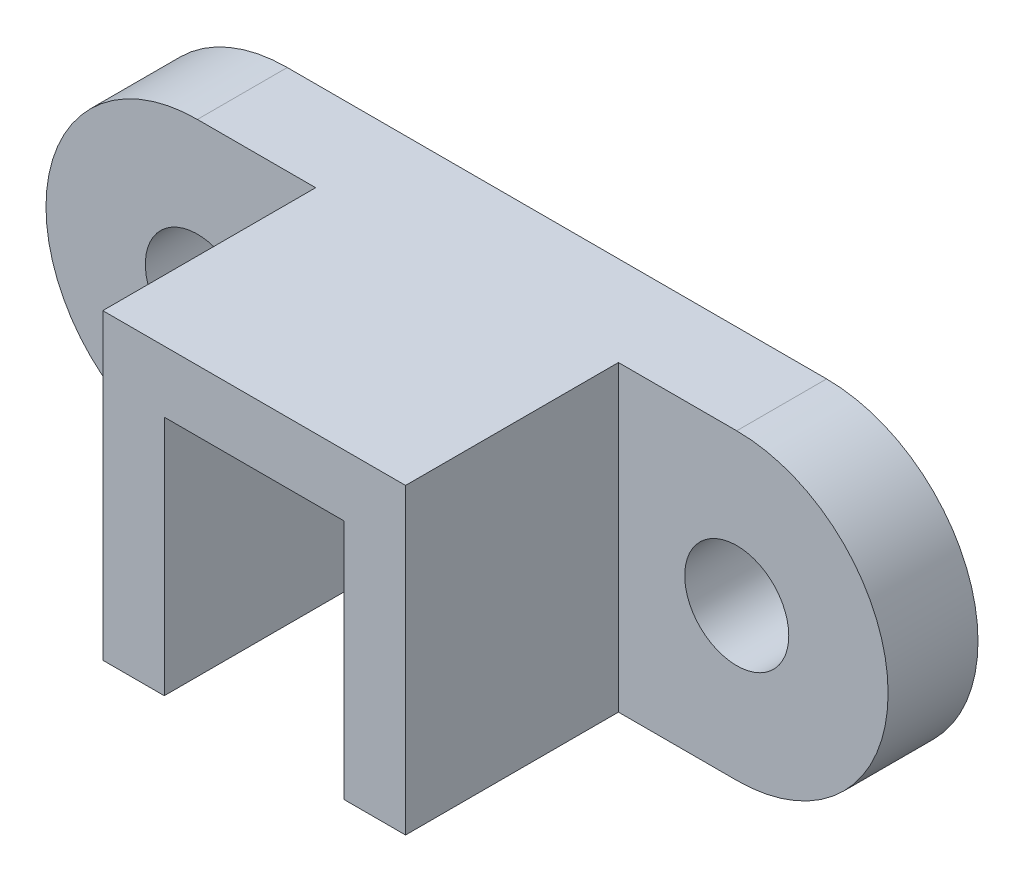
ISO-10303-21;
HEADER;
FILE_DESCRIPTION(('STEP AP214'),'2;1');
FILE_NAME('part.step','',(''),(''),'','','');
FILE_SCHEMA(('AUTOMOTIVE_DESIGN { 1 0 10303 214 1 1 1 1 }'));
ENDSEC;
DATA;
#1=APPLICATION_CONTEXT('core data for automotive mechanical design processes');
#2=APPLICATION_PROTOCOL_DEFINITION('international standard','automotive_design',2000,#1);
#3=PRODUCT_CONTEXT('',#1,'mechanical');
#4=PRODUCT('Part','Part','',(#3));
#5=PRODUCT_RELATED_PRODUCT_CATEGORY('part','',(#4));
#6=PRODUCT_DEFINITION_FORMATION('','',#4);
#7=PRODUCT_DEFINITION_CONTEXT('part definition',#1,'design');
#8=PRODUCT_DEFINITION('design','',#6,#7);
#9=PRODUCT_DEFINITION_SHAPE('','',#8);
#10=(LENGTH_UNIT() NAMED_UNIT(*) SI_UNIT(.MILLI.,.METRE.));
#11=(NAMED_UNIT(*) PLANE_ANGLE_UNIT() SI_UNIT($,.RADIAN.));
#12=(NAMED_UNIT(*) SI_UNIT($,.STERADIAN.) SOLID_ANGLE_UNIT());
#13=UNCERTAINTY_MEASURE_WITH_UNIT(LENGTH_MEASURE(1.E-05),#10,'distance_accuracy_value','');
#14=(GEOMETRIC_REPRESENTATION_CONTEXT(3) GLOBAL_UNCERTAINTY_ASSIGNED_CONTEXT((#13)) GLOBAL_UNIT_ASSIGNED_CONTEXT((#10,
#11,#12)) REPRESENTATION_CONTEXT('',''));
#15=CARTESIAN_POINT('',(0.,0.,0.));
#16=DIRECTION('',(0.,0.,1.));
#17=DIRECTION('',(1.,0.,0.));
#18=AXIS2_PLACEMENT_3D('',#15,#16,#17);
#19=CARTESIAN_POINT('',(19.,19.,13.));
#20=DIRECTION('',(1.,0.,0.));
#21=DIRECTION('',(0.,0.,-1.));
#22=AXIS2_PLACEMENT_3D('',#19,#20,#21);
#23=PLANE('',#22);
#24=DIRECTION('',(0.,0.707106781186548,0.707106781186548));
#25=VECTOR('',#24,1.);
#26=CARTESIAN_POINT('',(19.,19.,64.));
#27=LINE('',#26,#25);
#28=CARTESIAN_POINT('',(19.,-32.,13.));
#29=VERTEX_POINT('',#28);
#30=CARTESIAN_POINT('',(19.,19.,64.));
#31=VERTEX_POINT('',#30);
#32=EDGE_CURVE('E139',#29,#31,#27,.T.);
#33=ORIENTED_EDGE('',*,*,#32,.F.);
#34=DIRECTION('',(0.,0.,1.));
#35=VECTOR('',#34,1.);
#36=CARTESIAN_POINT('',(19.,-32.,13.));
#37=LINE('',#36,#35);
#38=CARTESIAN_POINT('',(19.,-32.,64.));
#39=VERTEX_POINT('',#38);
#40=EDGE_CURVE('E142',#29,#39,#37,.T.);
#41=ORIENTED_EDGE('',*,*,#40,.T.);
#42=DIRECTION('',(0.,-1.,0.));
#43=VECTOR('',#42,1.);
#44=CARTESIAN_POINT('',(19.,19.,64.));
#45=LINE('',#44,#43);
#46=EDGE_CURVE('E54',#31,#39,#45,.T.);
#47=ORIENTED_EDGE('',*,*,#46,.F.);
#48=EDGE_LOOP('',(#33,#41,#47));
#49=FACE_BOUND('',#48,.T.);
#50=ADVANCED_FACE('F39',(#49),#23,.F.);
#51=CARTESIAN_POINT('',(-19.,19.,64.));
#52=DIRECTION('',(-1.,0.,0.));
#53=DIRECTION('',(0.,0.,1.));
#54=AXIS2_PLACEMENT_3D('',#51,#52,#53);
#55=PLANE('',#54);
#56=DIRECTION('',(0.,0.707106781186548,0.707106781186548));
#57=VECTOR('',#56,1.);
#58=CARTESIAN_POINT('',(-19.,19.,64.));
#59=LINE('',#58,#57);
#60=CARTESIAN_POINT('',(-19.,-32.,13.));
#61=VERTEX_POINT('',#60);
#62=CARTESIAN_POINT('',(-19.,19.,64.));
#63=VERTEX_POINT('',#62);
#64=EDGE_CURVE('E133',#61,#63,#59,.T.);
#65=ORIENTED_EDGE('',*,*,#64,.T.);
#66=DIRECTION('',(0.,-1.,0.));
#67=VECTOR('',#66,1.);
#68=CARTESIAN_POINT('',(-19.,19.,64.));
#69=LINE('',#68,#67);
#70=CARTESIAN_POINT('',(-19.,-32.,64.));
#71=VERTEX_POINT('',#70);
#72=EDGE_CURVE('E121',#63,#71,#69,.T.);
#73=ORIENTED_EDGE('',*,*,#72,.T.);
#74=DIRECTION('',(0.,0.,-1.));
#75=VECTOR('',#74,1.);
#76=CARTESIAN_POINT('',(-19.,-32.,64.));
#77=LINE('',#76,#75);
#78=EDGE_CURVE('E135',#71,#61,#77,.T.);
#79=ORIENTED_EDGE('',*,*,#78,.T.);
#80=EDGE_LOOP('',(#65,#73,#79));
#81=FACE_BOUND('',#80,.T.);
#82=ADVANCED_FACE('F134',(#81),#55,.F.);
#83=CARTESIAN_POINT('',(-57.,0.,19.));
#84=DIRECTION('',(0.,0.,1.));
#85=DIRECTION('',(1.,0.,0.));
#86=AXIS2_PLACEMENT_3D('',#83,#84,#85);
#87=PLANE('',#86);
#88=DIRECTION('',(0.,1.,0.));
#89=VECTOR('',#88,1.);
#90=CARTESIAN_POINT('',(32.,-32.,19.));
#91=LINE('',#90,#89);
#92=CARTESIAN_POINT('',(32.,-32.,19.));
#93=VERTEX_POINT('',#92);
#94=CARTESIAN_POINT('',(32.,32.,19.));
#95=VERTEX_POINT('',#94);
#96=EDGE_CURVE('E155',#93,#95,#91,.T.);
#97=ORIENTED_EDGE('',*,*,#96,.F.);
#98=DIRECTION('',(1.,0.,0.));
#99=VECTOR('',#98,1.);
#100=CARTESIAN_POINT('',(-57.,-32.,19.));
#101=LINE('',#100,#99);
#102=CARTESIAN_POINT('',(57.,-32.,19.));
#103=VERTEX_POINT('',#102);
#104=EDGE_CURVE('E192',#93,#103,#101,.T.);
#105=ORIENTED_EDGE('',*,*,#104,.T.);
#106=CARTESIAN_POINT('',(57.,0.,19.));
#107=DIRECTION('',(0.,0.,1.));
#108=DIRECTION('',(1.,0.,0.));
#109=AXIS2_PLACEMENT_3D('',#106,#107,#108);
#110=CIRCLE('',#109,32.);
#111=CARTESIAN_POINT('',(57.,32.,19.));
#112=VERTEX_POINT('',#111);
#113=EDGE_CURVE('E196',#103,#112,#110,.T.);
#114=ORIENTED_EDGE('',*,*,#113,.T.);
#115=DIRECTION('',(-1.,0.,0.));
#116=VECTOR('',#115,1.);
#117=CARTESIAN_POINT('',(-57.,32.,19.));
#118=LINE('',#117,#116);
#119=EDGE_CURVE('E199',#112,#95,#118,.T.);
#120=ORIENTED_EDGE('',*,*,#119,.T.);
#121=EDGE_LOOP('',(#97,#105,#114,#120));
#122=FACE_BOUND('',#121,.T.);
#123=CARTESIAN_POINT('',(57.,0.,19.));
#124=DIRECTION('',(0.,0.,1.));
#125=DIRECTION('',(1.,0.,0.));
#126=AXIS2_PLACEMENT_3D('',#123,#124,#125);
#127=CIRCLE('',#126,11.);
#128=CARTESIAN_POINT('',(68.,0.,19.));
#129=VERTEX_POINT('',#128);
#130=EDGE_CURVE('E184',#129,#129,#127,.T.);
#131=ORIENTED_EDGE('',*,*,#130,.F.);
#132=EDGE_LOOP('',(#131));
#133=FACE_BOUND('',#132,.T.);
#134=ADVANCED_FACE('F246',(#122,#133),#87,.T.);
#135=CARTESIAN_POINT('',(-57.,0.,19.));
#136=DIRECTION('',(0.,0.,-1.));
#137=DIRECTION('',(-1.,0.,0.));
#138=AXIS2_PLACEMENT_3D('',#135,#136,#137);
#139=CYLINDRICAL_SURFACE('',#138,32.);
#140=CARTESIAN_POINT('',(-57.,0.,0.));
#141=DIRECTION('',(0.,0.,1.));
#142=DIRECTION('',(1.,0.,0.));
#143=AXIS2_PLACEMENT_3D('',#140,#141,#142);
#144=CIRCLE('',#143,32.);
#145=CARTESIAN_POINT('',(-57.,32.,0.));
#146=VERTEX_POINT('',#145);
#147=CARTESIAN_POINT('',(-57.,-32.,0.));
#148=VERTEX_POINT('',#147);
#149=EDGE_CURVE('E180',#146,#148,#144,.T.);
#150=ORIENTED_EDGE('',*,*,#149,.T.);
#151=DIRECTION('',(0.,0.,-1.));
#152=VECTOR('',#151,1.);
#153=CARTESIAN_POINT('',(-57.,-32.,19.));
#154=LINE('',#153,#152);
#155=CARTESIAN_POINT('',(-57.,-32.,19.));
#156=VERTEX_POINT('',#155);
#157=EDGE_CURVE('E11',#156,#148,#154,.T.);
#158=ORIENTED_EDGE('',*,*,#157,.F.);
#159=CARTESIAN_POINT('',(-57.,0.,19.));
#160=DIRECTION('',(0.,0.,1.));
#161=DIRECTION('',(1.,0.,0.));
#162=AXIS2_PLACEMENT_3D('',#159,#160,#161);
#163=CIRCLE('',#162,32.);
#164=CARTESIAN_POINT('',(-57.,32.,19.));
#165=VERTEX_POINT('',#164);
#166=EDGE_CURVE('E189',#165,#156,#163,.T.);
#167=ORIENTED_EDGE('',*,*,#166,.F.);
#168=DIRECTION('',(0.,0.,-1.));
#169=VECTOR('',#168,1.);
#170=CARTESIAN_POINT('',(-57.,32.,19.));
#171=LINE('',#170,#169);
#172=EDGE_CURVE('E201',#165,#146,#171,.T.);
#173=ORIENTED_EDGE('',*,*,#172,.T.);
#174=EDGE_LOOP('',(#150,#158,#167,#173));
#175=FACE_BOUND('',#174,.T.);
#176=ADVANCED_FACE('F41',(#175),#139,.T.);
#177=CARTESIAN_POINT('',(-57.,-32.,19.));
#178=DIRECTION('',(0.,1.,0.));
#179=DIRECTION('',(0.,0.,1.));
#180=AXIS2_PLACEMENT_3D('',#177,#178,#179);
#181=PLANE('',#180);
#182=DIRECTION('',(1.,0.,0.));
#183=VECTOR('',#182,1.);
#184=CARTESIAN_POINT('',(-32.,-32.,64.));
#185=LINE('',#184,#183);
#186=CARTESIAN_POINT('',(32.,-32.,64.));
#187=VERTEX_POINT('',#186);
#188=EDGE_CURVE('E157',#39,#187,#185,.T.);
#189=ORIENTED_EDGE('',*,*,#188,.F.);
#190=ORIENTED_EDGE('',*,*,#40,.F.);
#191=DIRECTION('',(1.,0.,0.));
#192=VECTOR('',#191,1.);
#193=CARTESIAN_POINT('',(-19.,-32.,13.));
#194=LINE('',#193,#192);
#195=EDGE_CURVE('E144',#61,#29,#194,.T.);
#196=ORIENTED_EDGE('',*,*,#195,.F.);
#197=ORIENTED_EDGE('',*,*,#78,.F.);
#198=CARTESIAN_POINT('',(-32.,-32.,64.));
#199=VERTEX_POINT('',#198);
#200=EDGE_CURVE('E128',#199,#71,#185,.T.);
#201=ORIENTED_EDGE('',*,*,#200,.F.);
#202=DIRECTION('',(0.,0.,-1.));
#203=VECTOR('',#202,1.);
#204=CARTESIAN_POINT('',(-32.,-32.,64.));
#205=LINE('',#204,#203);
#206=CARTESIAN_POINT('',(-32.,-32.,19.));
#207=VERTEX_POINT('',#206);
#208=EDGE_CURVE('E170',#199,#207,#205,.T.);
#209=ORIENTED_EDGE('',*,*,#208,.T.);
#210=EDGE_CURVE('E194',#156,#207,#101,.T.);
#211=ORIENTED_EDGE('',*,*,#210,.F.);
#212=ORIENTED_EDGE('',*,*,#157,.T.);
#213=DIRECTION('',(1.,0.,0.));
#214=VECTOR('',#213,1.);
#215=CARTESIAN_POINT('',(-57.,-32.,0.));
#216=LINE('',#215,#214);
#217=CARTESIAN_POINT('',(57.,-32.,0.));
#218=VERTEX_POINT('',#217);
#219=EDGE_CURVE('E204',#148,#218,#216,.T.);
#220=ORIENTED_EDGE('',*,*,#219,.T.);
#221=DIRECTION('',(0.,0.,-1.));
#222=VECTOR('',#221,1.);
#223=CARTESIAN_POINT('',(57.,-32.,19.));
#224=LINE('',#223,#222);
#225=EDGE_CURVE('E47',#103,#218,#224,.T.);
#226=ORIENTED_EDGE('',*,*,#225,.F.);
#227=ORIENTED_EDGE('',*,*,#104,.F.);
#228=DIRECTION('',(0.,0.,-1.));
#229=VECTOR('',#228,1.);
#230=CARTESIAN_POINT('',(32.,-32.,64.));
#231=LINE('',#230,#229);
#232=EDGE_CURVE('E167',#187,#93,#231,.T.);
#233=ORIENTED_EDGE('',*,*,#232,.F.);
#234=EDGE_LOOP('',(#189,#190,#196,#197,#201,#209,#211,#212,#220,#226,#227,#233));
#235=FACE_BOUND('',#234,.T.);
#236=ADVANCED_FACE('F249',(#235),#181,.F.);
#237=CARTESIAN_POINT('',(57.,0.,19.));
#238=DIRECTION('',(0.,0.,-1.));
#239=DIRECTION('',(-1.,0.,0.));
#240=AXIS2_PLACEMENT_3D('',#237,#238,#239);
#241=CYLINDRICAL_SURFACE('',#240,32.);
#242=CARTESIAN_POINT('',(57.,0.,0.));
#243=DIRECTION('',(0.,0.,1.));
#244=DIRECTION('',(1.,0.,0.));
#245=AXIS2_PLACEMENT_3D('',#242,#243,#244);
#246=CIRCLE('',#245,32.);
#247=CARTESIAN_POINT('',(57.,32.,0.));
#248=VERTEX_POINT('',#247);
#249=EDGE_CURVE('E206',#218,#248,#246,.T.);
#250=ORIENTED_EDGE('',*,*,#249,.T.);
#251=DIRECTION('',(0.,0.,-1.));
#252=VECTOR('',#251,1.);
#253=CARTESIAN_POINT('',(57.,32.,19.));
#254=LINE('',#253,#252);
#255=EDGE_CURVE('E211',#112,#248,#254,.T.);
#256=ORIENTED_EDGE('',*,*,#255,.F.);
#257=ORIENTED_EDGE('',*,*,#113,.F.);
#258=ORIENTED_EDGE('',*,*,#225,.T.);
#259=EDGE_LOOP('',(#250,#256,#257,#258));
#260=FACE_BOUND('',#259,.T.);
#261=ADVANCED_FACE('F218',(#260),#241,.T.);
#262=CARTESIAN_POINT('',(-57.,32.,19.));
#263=DIRECTION('',(0.,-1.,0.));
#264=DIRECTION('',(0.,0.,-1.));
#265=AXIS2_PLACEMENT_3D('',#262,#263,#264);
#266=PLANE('',#265);
#267=DIRECTION('',(-1.,0.,0.));
#268=VECTOR('',#267,1.);
#269=CARTESIAN_POINT('',(-57.,32.,0.));
#270=LINE('',#269,#268);
#271=EDGE_CURVE('E193',#248,#146,#270,.T.);
#272=ORIENTED_EDGE('',*,*,#271,.T.);
#273=ORIENTED_EDGE('',*,*,#172,.F.);
#274=CARTESIAN_POINT('',(-32.,32.,19.));
#275=VERTEX_POINT('',#274);
#276=EDGE_CURVE('E198',#275,#165,#118,.T.);
#277=ORIENTED_EDGE('',*,*,#276,.F.);
#278=DIRECTION('',(0.,0.,-1.));
#279=VECTOR('',#278,1.);
#280=CARTESIAN_POINT('',(-32.,32.,64.));
#281=LINE('',#280,#279);
#282=CARTESIAN_POINT('',(-32.,32.,64.));
#283=VERTEX_POINT('',#282);
#284=EDGE_CURVE('E173',#283,#275,#281,.T.);
#285=ORIENTED_EDGE('',*,*,#284,.F.);
#286=DIRECTION('',(-1.,0.,0.));
#287=VECTOR('',#286,1.);
#288=CARTESIAN_POINT('',(32.,32.,64.));
#289=LINE('',#288,#287);
#290=CARTESIAN_POINT('',(32.,32.,64.));
#291=VERTEX_POINT('',#290);
#292=EDGE_CURVE('E151',#291,#283,#289,.T.);
#293=ORIENTED_EDGE('',*,*,#292,.F.);
#294=DIRECTION('',(0.,0.,-1.));
#295=VECTOR('',#294,1.);
#296=CARTESIAN_POINT('',(32.,32.,64.));
#297=LINE('',#296,#295);
#298=EDGE_CURVE('E161',#291,#95,#297,.T.);
#299=ORIENTED_EDGE('',*,*,#298,.T.);
#300=ORIENTED_EDGE('',*,*,#119,.F.);
#301=ORIENTED_EDGE('',*,*,#255,.T.);
#302=EDGE_LOOP('',(#272,#273,#277,#285,#293,#299,#300,#301));
#303=FACE_BOUND('',#302,.T.);
#304=ADVANCED_FACE('F228',(#303),#266,.F.);
#305=DIRECTION('',(0.,-1.,0.));
#306=VECTOR('',#305,1.);
#307=CARTESIAN_POINT('',(-32.,32.,19.));
#308=LINE('',#307,#306);
#309=EDGE_CURVE('E62',#275,#207,#308,.T.);
#310=ORIENTED_EDGE('',*,*,#309,.F.);
#311=ORIENTED_EDGE('',*,*,#276,.T.);
#312=ORIENTED_EDGE('',*,*,#166,.T.);
#313=ORIENTED_EDGE('',*,*,#210,.T.);
#314=EDGE_LOOP('',(#310,#311,#312,#313));
#315=FACE_BOUND('',#314,.T.);
#316=CARTESIAN_POINT('',(-57.,0.,19.));
#317=DIRECTION('',(0.,0.,1.));
#318=DIRECTION('',(1.,0.,0.));
#319=AXIS2_PLACEMENT_3D('',#316,#317,#318);
#320=CIRCLE('',#319,11.);
#321=CARTESIAN_POINT('',(-46.,0.,19.));
#322=VERTEX_POINT('',#321);
#323=EDGE_CURVE('E181',#322,#322,#320,.T.);
#324=ORIENTED_EDGE('',*,*,#323,.F.);
#325=EDGE_LOOP('',(#324));
#326=FACE_BOUND('',#325,.T.);
#327=ADVANCED_FACE('F233',(#315,#326),#87,.T.);
#328=CARTESIAN_POINT('',(-57.,0.,0.));
#329=DIRECTION('',(0.,0.,1.));
#330=DIRECTION('',(1.,0.,0.));
#331=AXIS2_PLACEMENT_3D('',#328,#329,#330);
#332=PLANE('',#331);
#333=CARTESIAN_POINT('',(-57.,0.,0.));
#334=DIRECTION('',(0.,0.,1.));
#335=DIRECTION('',(1.,0.,0.));
#336=AXIS2_PLACEMENT_3D('',#333,#334,#335);
#337=CIRCLE('',#336,11.);
#338=CARTESIAN_POINT('',(-46.,0.,0.));
#339=VERTEX_POINT('',#338);
#340=EDGE_CURVE('E177',#339,#339,#337,.T.);
#341=ORIENTED_EDGE('',*,*,#340,.T.);
#342=EDGE_LOOP('',(#341));
#343=FACE_BOUND('',#342,.T.);
#344=CARTESIAN_POINT('',(57.,0.,0.));
#345=DIRECTION('',(0.,0.,1.));
#346=DIRECTION('',(1.,0.,0.));
#347=AXIS2_PLACEMENT_3D('',#344,#345,#346);
#348=CIRCLE('',#347,11.);
#349=CARTESIAN_POINT('',(68.,0.,0.));
#350=VERTEX_POINT('',#349);
#351=EDGE_CURVE('E176',#350,#350,#348,.T.);
#352=ORIENTED_EDGE('',*,*,#351,.T.);
#353=EDGE_LOOP('',(#352));
#354=FACE_BOUND('',#353,.T.);
#355=ORIENTED_EDGE('',*,*,#149,.F.);
#356=ORIENTED_EDGE('',*,*,#271,.F.);
#357=ORIENTED_EDGE('',*,*,#249,.F.);
#358=ORIENTED_EDGE('',*,*,#219,.F.);
#359=EDGE_LOOP('',(#355,#356,#357,#358));
#360=FACE_BOUND('',#359,.T.);
#361=ADVANCED_FACE('F225',(#343,#354,#360),#332,.F.);
#362=CARTESIAN_POINT('',(57.,0.,0.));
#363=DIRECTION('',(0.,0.,1.));
#364=DIRECTION('',(1.,0.,0.));
#365=AXIS2_PLACEMENT_3D('',#362,#363,#364);
#366=CYLINDRICAL_SURFACE('',#365,11.);
#367=ORIENTED_EDGE('',*,*,#351,.F.);
#368=EDGE_LOOP('',(#367));
#369=FACE_BOUND('',#368,.T.);
#370=ORIENTED_EDGE('',*,*,#130,.T.);
#371=EDGE_LOOP('',(#370));
#372=FACE_BOUND('',#371,.T.);
#373=ADVANCED_FACE('F268',(#369,#372),#366,.F.);
#374=CARTESIAN_POINT('',(-57.,0.,0.));
#375=DIRECTION('',(0.,0.,1.));
#376=DIRECTION('',(1.,0.,0.));
#377=AXIS2_PLACEMENT_3D('',#374,#375,#376);
#378=CYLINDRICAL_SURFACE('',#377,11.);
#379=ORIENTED_EDGE('',*,*,#340,.F.);
#380=EDGE_LOOP('',(#379));
#381=FACE_BOUND('',#380,.T.);
#382=ORIENTED_EDGE('',*,*,#323,.T.);
#383=EDGE_LOOP('',(#382));
#384=FACE_BOUND('',#383,.T.);
#385=ADVANCED_FACE('F265',(#381,#384),#378,.F.);
#386=CARTESIAN_POINT('',(-32.,32.,64.));
#387=DIRECTION('',(1.,0.,0.));
#388=DIRECTION('',(0.,0.,-1.));
#389=AXIS2_PLACEMENT_3D('',#386,#387,#388);
#390=PLANE('',#389);
#391=ORIENTED_EDGE('',*,*,#309,.T.);
#392=ORIENTED_EDGE('',*,*,#208,.F.);
#393=DIRECTION('',(0.,-1.,0.));
#394=VECTOR('',#393,1.);
#395=CARTESIAN_POINT('',(-32.,32.,64.));
#396=LINE('',#395,#394);
#397=EDGE_CURVE('E154',#283,#199,#396,.T.);
#398=ORIENTED_EDGE('',*,*,#397,.F.);
#399=ORIENTED_EDGE('',*,*,#284,.T.);
#400=EDGE_LOOP('',(#391,#392,#398,#399));
#401=FACE_BOUND('',#400,.T.);
#402=ADVANCED_FACE('F238',(#401),#390,.F.);
#403=CARTESIAN_POINT('',(32.,-32.,64.));
#404=DIRECTION('',(-1.,0.,0.));
#405=DIRECTION('',(0.,0.,1.));
#406=AXIS2_PLACEMENT_3D('',#403,#404,#405);
#407=PLANE('',#406);
#408=ORIENTED_EDGE('',*,*,#96,.T.);
#409=ORIENTED_EDGE('',*,*,#298,.F.);
#410=DIRECTION('',(0.,1.,0.));
#411=VECTOR('',#410,1.);
#412=CARTESIAN_POINT('',(32.,-32.,64.));
#413=LINE('',#412,#411);
#414=EDGE_CURVE('E159',#187,#291,#413,.T.);
#415=ORIENTED_EDGE('',*,*,#414,.F.);
#416=ORIENTED_EDGE('',*,*,#232,.T.);
#417=EDGE_LOOP('',(#408,#409,#415,#416));
#418=FACE_BOUND('',#417,.T.);
#419=ADVANCED_FACE('F243',(#418),#407,.F.);
#420=CARTESIAN_POINT('',(0.,0.,64.));
#421=DIRECTION('',(0.,0.,1.));
#422=DIRECTION('',(1.,0.,0.));
#423=AXIS2_PLACEMENT_3D('',#420,#421,#422);
#424=PLANE('',#423);
#425=ORIENTED_EDGE('',*,*,#46,.T.);
#426=ORIENTED_EDGE('',*,*,#188,.T.);
#427=ORIENTED_EDGE('',*,*,#414,.T.);
#428=ORIENTED_EDGE('',*,*,#292,.T.);
#429=ORIENTED_EDGE('',*,*,#397,.T.);
#430=ORIENTED_EDGE('',*,*,#200,.T.);
#431=ORIENTED_EDGE('',*,*,#72,.F.);
#432=DIRECTION('',(-1.,0.,0.));
#433=VECTOR('',#432,1.);
#434=CARTESIAN_POINT('',(19.,19.,64.));
#435=LINE('',#434,#433);
#436=EDGE_CURVE('E125',#31,#63,#435,.T.);
#437=ORIENTED_EDGE('',*,*,#436,.F.);
#438=EDGE_LOOP('',(#425,#426,#427,#428,#429,#430,#431,#437));
#439=FACE_BOUND('',#438,.T.);
#440=ADVANCED_FACE('F123',(#439),#424,.T.);
#441=CARTESIAN_POINT('',(-19.,19.,64.));
#442=DIRECTION('',(0.,0.707106781186548,-0.707106781186547));
#443=DIRECTION('',(0.,0.707106781186547,0.707106781186548));
#444=AXIS2_PLACEMENT_3D('',#441,#442,#443);
#445=PLANE('',#444);
#446=ORIENTED_EDGE('',*,*,#32,.T.);
#447=ORIENTED_EDGE('',*,*,#436,.T.);
#448=ORIENTED_EDGE('',*,*,#64,.F.);
#449=ORIENTED_EDGE('',*,*,#195,.T.);
#450=EDGE_LOOP('',(#446,#447,#448,#449));
#451=FACE_BOUND('',#450,.T.);
#452=ADVANCED_FACE('F141',(#451),#445,.F.);
#453=CLOSED_SHELL('',(#50,#82,#134,#176,#236,#261,#304,#327,#361,#373,#385,#402,#419,#440,#452));
#454=MANIFOLD_SOLID_BREP('B2',#453);
#455=ADVANCED_BREP_SHAPE_REPRESENTATION('',(#18,#454),#14);
#456=SHAPE_DEFINITION_REPRESENTATION(#9,#455);
ENDSEC;
END-ISO-10303-21;
